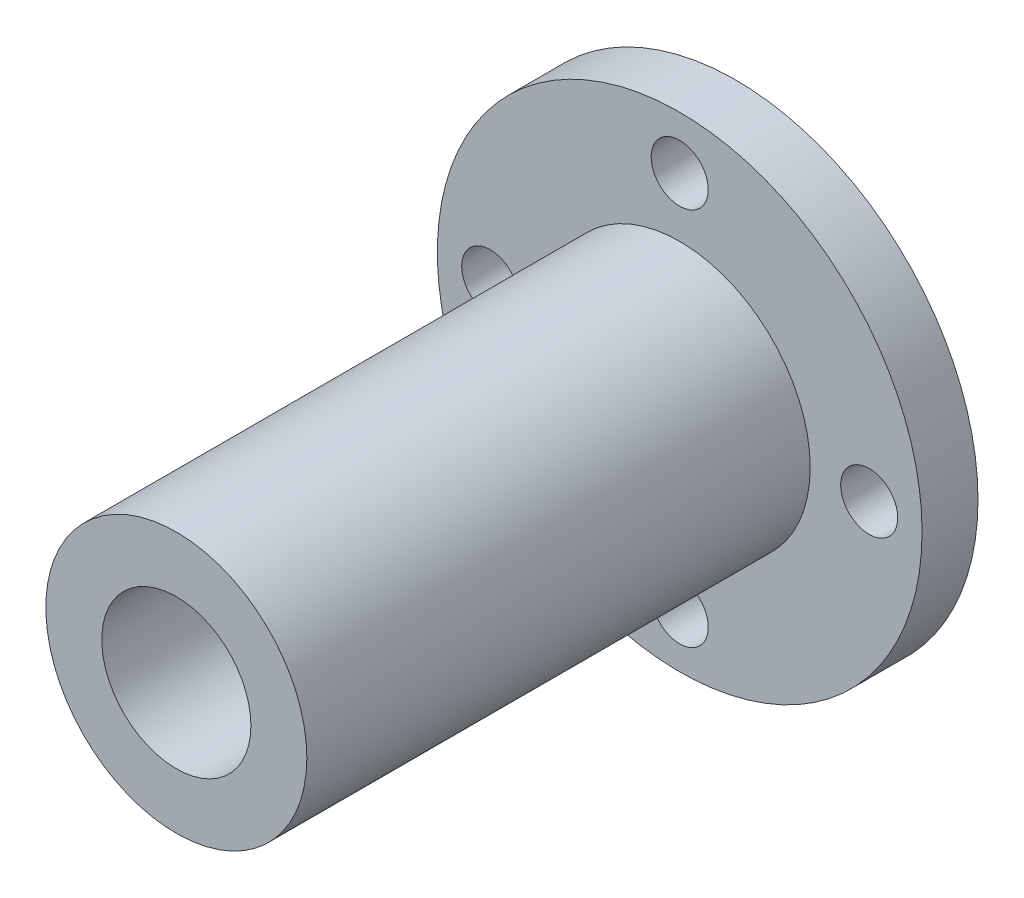
ISO-10303-21;
HEADER;
FILE_DESCRIPTION(('STEP AP214'),'2;1');
FILE_NAME('part.step','',(''),(''),'','','');
FILE_SCHEMA(('AUTOMOTIVE_DESIGN { 1 0 10303 214 1 1 1 1 }'));
ENDSEC;
DATA;
#1=APPLICATION_CONTEXT('core data for automotive mechanical design processes');
#2=APPLICATION_PROTOCOL_DEFINITION('international standard','automotive_design',2000,#1);
#3=PRODUCT_CONTEXT('',#1,'mechanical');
#4=PRODUCT('Part','Part','',(#3));
#5=PRODUCT_RELATED_PRODUCT_CATEGORY('part','',(#4));
#6=PRODUCT_DEFINITION_FORMATION('','',#4);
#7=PRODUCT_DEFINITION_CONTEXT('part definition',#1,'design');
#8=PRODUCT_DEFINITION('design','',#6,#7);
#9=PRODUCT_DEFINITION_SHAPE('','',#8);
#10=(LENGTH_UNIT() NAMED_UNIT(*) SI_UNIT(.MILLI.,.METRE.));
#11=(NAMED_UNIT(*) PLANE_ANGLE_UNIT() SI_UNIT($,.RADIAN.));
#12=(NAMED_UNIT(*) SI_UNIT($,.STERADIAN.) SOLID_ANGLE_UNIT());
#13=UNCERTAINTY_MEASURE_WITH_UNIT(LENGTH_MEASURE(1.E-05),#10,'distance_accuracy_value','');
#14=(GEOMETRIC_REPRESENTATION_CONTEXT(3) GLOBAL_UNCERTAINTY_ASSIGNED_CONTEXT((#13)) GLOBAL_UNIT_ASSIGNED_CONTEXT((#10,
#11,#12)) REPRESENTATION_CONTEXT('',''));
#15=CARTESIAN_POINT('',(0.,0.,0.));
#16=DIRECTION('',(0.,0.,1.));
#17=DIRECTION('',(1.,0.,0.));
#18=AXIS2_PLACEMENT_3D('',#15,#16,#17);
#19=CARTESIAN_POINT('',(0.,-4.,49.0461538461539));
#20=DIRECTION('',(0.,0.,1.));
#21=DIRECTION('',(1.,0.,0.));
#22=AXIS2_PLACEMENT_3D('',#19,#20,#21);
#23=CYLINDRICAL_SURFACE('',#22,4.);
#24=CARTESIAN_POINT('',(0.,-4.,0.));
#25=DIRECTION('',(0.,0.,1.));
#26=DIRECTION('',(1.,0.,0.));
#27=AXIS2_PLACEMENT_3D('',#24,#25,#26);
#28=CIRCLE('',#27,4.);
#29=CARTESIAN_POINT('',(4.,-4.,0.));
#30=VERTEX_POINT('',#29);
#31=EDGE_CURVE('E53',#30,#30,#28,.T.);
#32=ORIENTED_EDGE('',*,*,#31,.F.);
#33=EDGE_LOOP('',(#32));
#34=FACE_BOUND('',#33,.T.);
#35=CARTESIAN_POINT('',(0.,-4.,30.));
#36=DIRECTION('',(0.,0.,1.));
#37=DIRECTION('',(1.,0.,0.));
#38=AXIS2_PLACEMENT_3D('',#35,#36,#37);
#39=CIRCLE('',#38,4.);
#40=CARTESIAN_POINT('',(4.,-4.,30.));
#41=VERTEX_POINT('',#40);
#42=EDGE_CURVE('E10',#41,#41,#39,.T.);
#43=ORIENTED_EDGE('',*,*,#42,.T.);
#44=EDGE_LOOP('',(#43));
#45=FACE_BOUND('',#44,.T.);
#46=ADVANCED_FACE('F31',(#34,#45),#23,.F.);
#47=CARTESIAN_POINT('',(0.,0.,30.));
#48=DIRECTION('',(0.,0.,-1.));
#49=DIRECTION('',(-1.,0.,0.));
#50=AXIS2_PLACEMENT_3D('',#47,#48,#49);
#51=PLANE('',#50);
#52=ORIENTED_EDGE('',*,*,#42,.F.);
#53=EDGE_LOOP('',(#52));
#54=FACE_BOUND('',#53,.T.);
#55=CARTESIAN_POINT('',(0.,-4.,30.));
#56=DIRECTION('',(0.,0.,1.));
#57=DIRECTION('',(1.,0.,0.));
#58=AXIS2_PLACEMENT_3D('',#55,#56,#57);
#59=CIRCLE('',#58,7.);
#60=CARTESIAN_POINT('',(7.,-4.,30.));
#61=VERTEX_POINT('',#60);
#62=EDGE_CURVE('E37',#61,#61,#59,.T.);
#63=ORIENTED_EDGE('',*,*,#62,.T.);
#64=EDGE_LOOP('',(#63));
#65=FACE_BOUND('',#64,.T.);
#66=ADVANCED_FACE('F101',(#54,#65),#51,.F.);
#67=CARTESIAN_POINT('',(0.,-4.,49.0461538461539));
#68=DIRECTION('',(0.,0.,1.));
#69=DIRECTION('',(1.,0.,0.));
#70=AXIS2_PLACEMENT_3D('',#67,#68,#69);
#71=CYLINDRICAL_SURFACE('',#70,7.);
#72=ORIENTED_EDGE('',*,*,#62,.F.);
#73=EDGE_LOOP('',(#72));
#74=FACE_BOUND('',#73,.T.);
#75=CARTESIAN_POINT('',(0.,-4.,3.));
#76=DIRECTION('',(0.,0.,1.));
#77=DIRECTION('',(1.,0.,0.));
#78=AXIS2_PLACEMENT_3D('',#75,#76,#77);
#79=CIRCLE('',#78,7.);
#80=CARTESIAN_POINT('',(7.,-4.,3.));
#81=VERTEX_POINT('',#80);
#82=EDGE_CURVE('E41',#81,#81,#79,.T.);
#83=ORIENTED_EDGE('',*,*,#82,.T.);
#84=EDGE_LOOP('',(#83));
#85=FACE_BOUND('',#84,.T.);
#86=ADVANCED_FACE('F105',(#74,#85),#71,.T.);
#87=CARTESIAN_POINT('',(0.,9.,3.));
#88=DIRECTION('',(0.,0.,-1.));
#89=DIRECTION('',(-1.,0.,0.));
#90=AXIS2_PLACEMENT_3D('',#87,#88,#89);
#91=PLANE('',#90);
#92=CARTESIAN_POINT('',(-10.1638412355352,-4.00000000000004,3.));
#93=DIRECTION('',(0.,0.,-1.));
#94=DIRECTION('',(-1.,0.,0.));
#95=AXIS2_PLACEMENT_3D('',#92,#93,#94);
#96=CIRCLE('',#95,1.53090788465993);
#97=CARTESIAN_POINT('',(-11.6947491201952,-4.00000000000004,3.));
#98=VERTEX_POINT('',#97);
#99=EDGE_CURVE('E62',#98,#98,#96,.T.);
#100=ORIENTED_EDGE('',*,*,#99,.T.);
#101=EDGE_LOOP('',(#100));
#102=FACE_BOUND('',#101,.T.);
#103=CARTESIAN_POINT('',(0.,-14.1638412355352,3.));
#104=DIRECTION('',(0.,0.,-1.));
#105=DIRECTION('',(-1.,0.,0.));
#106=AXIS2_PLACEMENT_3D('',#103,#104,#105);
#107=CIRCLE('',#106,1.53090788465993);
#108=CARTESIAN_POINT('',(-1.53090788465986,-14.1638412355352,3.));
#109=VERTEX_POINT('',#108);
#110=EDGE_CURVE('E65',#109,#109,#107,.T.);
#111=ORIENTED_EDGE('',*,*,#110,.T.);
#112=EDGE_LOOP('',(#111));
#113=FACE_BOUND('',#112,.T.);
#114=CARTESIAN_POINT('',(10.1638412355352,-3.99999999999989,3.));
#115=DIRECTION('',(0.,0.,-1.));
#116=DIRECTION('',(-1.,0.,0.));
#117=AXIS2_PLACEMENT_3D('',#114,#115,#116);
#118=CIRCLE('',#117,1.53090788465993);
#119=CARTESIAN_POINT('',(8.63293335087532,-3.99999999999989,3.));
#120=VERTEX_POINT('',#119);
#121=EDGE_CURVE('E68',#120,#120,#118,.T.);
#122=ORIENTED_EDGE('',*,*,#121,.T.);
#123=EDGE_LOOP('',(#122));
#124=FACE_BOUND('',#123,.T.);
#125=CARTESIAN_POINT('',(0.,6.16384123553525,3.));
#126=DIRECTION('',(0.,0.,-1.));
#127=DIRECTION('',(-1.,0.,0.));
#128=AXIS2_PLACEMENT_3D('',#125,#126,#127);
#129=CIRCLE('',#128,1.53090788465993);
#130=CARTESIAN_POINT('',(-1.53090788465993,6.16384123553525,3.));
#131=VERTEX_POINT('',#130);
#132=EDGE_CURVE('E56',#131,#131,#129,.T.);
#133=ORIENTED_EDGE('',*,*,#132,.T.);
#134=EDGE_LOOP('',(#133));
#135=FACE_BOUND('',#134,.T.);
#136=ORIENTED_EDGE('',*,*,#82,.F.);
#137=EDGE_LOOP('',(#136));
#138=FACE_BOUND('',#137,.T.);
#139=CARTESIAN_POINT('',(0.,-4.,3.));
#140=DIRECTION('',(0.,0.,1.));
#141=DIRECTION('',(1.,0.,0.));
#142=AXIS2_PLACEMENT_3D('',#139,#140,#141);
#143=CIRCLE('',#142,13.);
#144=CARTESIAN_POINT('',(13.,-4.,3.));
#145=VERTEX_POINT('',#144);
#146=EDGE_CURVE('E45',#145,#145,#143,.T.);
#147=ORIENTED_EDGE('',*,*,#146,.T.);
#148=EDGE_LOOP('',(#147));
#149=FACE_BOUND('',#148,.T.);
#150=ADVANCED_FACE('F110',(#102,#113,#124,#135,#138,#149),#91,.F.);
#151=CARTESIAN_POINT('',(0.,-4.,49.0461538461539));
#152=DIRECTION('',(0.,0.,1.));
#153=DIRECTION('',(1.,0.,0.));
#154=AXIS2_PLACEMENT_3D('',#151,#152,#153);
#155=CYLINDRICAL_SURFACE('',#154,13.);
#156=ORIENTED_EDGE('',*,*,#146,.F.);
#157=EDGE_LOOP('',(#156));
#158=FACE_BOUND('',#157,.T.);
#159=CARTESIAN_POINT('',(0.,-4.,0.));
#160=DIRECTION('',(0.,0.,1.));
#161=DIRECTION('',(1.,0.,0.));
#162=AXIS2_PLACEMENT_3D('',#159,#160,#161);
#163=CIRCLE('',#162,13.);
#164=CARTESIAN_POINT('',(13.,-4.,0.));
#165=VERTEX_POINT('',#164);
#166=EDGE_CURVE('E50',#165,#165,#163,.T.);
#167=ORIENTED_EDGE('',*,*,#166,.T.);
#168=EDGE_LOOP('',(#167));
#169=FACE_BOUND('',#168,.T.);
#170=ADVANCED_FACE('F88',(#158,#169),#155,.T.);
#171=CARTESIAN_POINT('',(0.,0.,0.));
#172=DIRECTION('',(0.,0.,1.));
#173=DIRECTION('',(1.,0.,0.));
#174=AXIS2_PLACEMENT_3D('',#171,#172,#173);
#175=PLANE('',#174);
#176=CARTESIAN_POINT('',(-10.1638412355352,-4.00000000000004,0.));
#177=DIRECTION('',(0.,0.,-1.));
#178=DIRECTION('',(-1.,0.,0.));
#179=AXIS2_PLACEMENT_3D('',#176,#177,#178);
#180=CIRCLE('',#179,1.53090788465993);
#181=CARTESIAN_POINT('',(-11.6947491201952,-4.00000000000004,0.));
#182=VERTEX_POINT('',#181);
#183=EDGE_CURVE('E71',#182,#182,#180,.T.);
#184=ORIENTED_EDGE('',*,*,#183,.F.);
#185=EDGE_LOOP('',(#184));
#186=FACE_BOUND('',#185,.T.);
#187=CARTESIAN_POINT('',(0.,-14.1638412355352,0.));
#188=DIRECTION('',(0.,0.,-1.));
#189=DIRECTION('',(-1.,0.,0.));
#190=AXIS2_PLACEMENT_3D('',#187,#188,#189);
#191=CIRCLE('',#190,1.53090788465993);
#192=CARTESIAN_POINT('',(-1.53090788465986,-14.1638412355352,0.));
#193=VERTEX_POINT('',#192);
#194=EDGE_CURVE('E75',#193,#193,#191,.T.);
#195=ORIENTED_EDGE('',*,*,#194,.F.);
#196=EDGE_LOOP('',(#195));
#197=FACE_BOUND('',#196,.T.);
#198=CARTESIAN_POINT('',(10.1638412355352,-3.99999999999989,0.));
#199=DIRECTION('',(0.,0.,-1.));
#200=DIRECTION('',(-1.,0.,0.));
#201=AXIS2_PLACEMENT_3D('',#198,#199,#200);
#202=CIRCLE('',#201,1.53090788465993);
#203=CARTESIAN_POINT('',(8.63293335087532,-3.99999999999989,0.));
#204=VERTEX_POINT('',#203);
#205=EDGE_CURVE('E72',#204,#204,#202,.T.);
#206=ORIENTED_EDGE('',*,*,#205,.F.);
#207=EDGE_LOOP('',(#206));
#208=FACE_BOUND('',#207,.T.);
#209=CARTESIAN_POINT('',(0.,6.16384123553525,0.));
#210=DIRECTION('',(0.,0.,-1.));
#211=DIRECTION('',(-1.,0.,0.));
#212=AXIS2_PLACEMENT_3D('',#209,#210,#211);
#213=CIRCLE('',#212,1.53090788465993);
#214=CARTESIAN_POINT('',(-1.53090788465993,6.16384123553525,0.));
#215=VERTEX_POINT('',#214);
#216=EDGE_CURVE('E59',#215,#215,#213,.T.);
#217=ORIENTED_EDGE('',*,*,#216,.F.);
#218=EDGE_LOOP('',(#217));
#219=FACE_BOUND('',#218,.T.);
#220=ORIENTED_EDGE('',*,*,#166,.F.);
#221=EDGE_LOOP('',(#220));
#222=FACE_BOUND('',#221,.T.);
#223=ORIENTED_EDGE('',*,*,#31,.T.);
#224=EDGE_LOOP('',(#223));
#225=FACE_BOUND('',#224,.T.);
#226=ADVANCED_FACE('F84',(#186,#197,#208,#219,#222,#225),#175,.F.);
#227=CARTESIAN_POINT('',(0.,6.16384123553525,10.));
#228=DIRECTION('',(0.,0.,-1.));
#229=DIRECTION('',(-1.,0.,0.));
#230=AXIS2_PLACEMENT_3D('',#227,#228,#229);
#231=CYLINDRICAL_SURFACE('',#230,1.53090788465993);
#232=ORIENTED_EDGE('',*,*,#216,.T.);
#233=EDGE_LOOP('',(#232));
#234=FACE_BOUND('',#233,.T.);
#235=ORIENTED_EDGE('',*,*,#132,.F.);
#236=EDGE_LOOP('',(#235));
#237=FACE_BOUND('',#236,.T.);
#238=ADVANCED_FACE('F87',(#234,#237),#231,.F.);
#239=CARTESIAN_POINT('',(10.1638412355352,-3.99999999999989,10.));
#240=DIRECTION('',(0.,0.,-1.));
#241=DIRECTION('',(-1.,0.,0.));
#242=AXIS2_PLACEMENT_3D('',#239,#240,#241);
#243=CYLINDRICAL_SURFACE('',#242,1.53090788465993);
#244=ORIENTED_EDGE('',*,*,#205,.T.);
#245=EDGE_LOOP('',(#244));
#246=FACE_BOUND('',#245,.T.);
#247=ORIENTED_EDGE('',*,*,#121,.F.);
#248=EDGE_LOOP('',(#247));
#249=FACE_BOUND('',#248,.T.);
#250=ADVANCED_FACE('F122',(#246,#249),#243,.F.);
#251=CARTESIAN_POINT('',(0.,-14.1638412355352,10.));
#252=DIRECTION('',(0.,0.,-1.));
#253=DIRECTION('',(-1.,0.,0.));
#254=AXIS2_PLACEMENT_3D('',#251,#252,#253);
#255=CYLINDRICAL_SURFACE('',#254,1.53090788465993);
#256=ORIENTED_EDGE('',*,*,#194,.T.);
#257=EDGE_LOOP('',(#256));
#258=FACE_BOUND('',#257,.T.);
#259=ORIENTED_EDGE('',*,*,#110,.F.);
#260=EDGE_LOOP('',(#259));
#261=FACE_BOUND('',#260,.T.);
#262=ADVANCED_FACE('F126',(#258,#261),#255,.F.);
#263=CARTESIAN_POINT('',(-10.1638412355352,-4.00000000000004,10.));
#264=DIRECTION('',(0.,0.,-1.));
#265=DIRECTION('',(-1.,0.,0.));
#266=AXIS2_PLACEMENT_3D('',#263,#264,#265);
#267=CYLINDRICAL_SURFACE('',#266,1.53090788465993);
#268=ORIENTED_EDGE('',*,*,#183,.T.);
#269=EDGE_LOOP('',(#268));
#270=FACE_BOUND('',#269,.T.);
#271=ORIENTED_EDGE('',*,*,#99,.F.);
#272=EDGE_LOOP('',(#271));
#273=FACE_BOUND('',#272,.T.);
#274=ADVANCED_FACE('F81',(#270,#273),#267,.F.);
#275=CLOSED_SHELL('',(#46,#66,#86,#150,#170,#226,#238,#250,#262,#274));
#276=MANIFOLD_SOLID_BREP('B2',#275);
#277=ADVANCED_BREP_SHAPE_REPRESENTATION('',(#18,#276),#14);
#278=SHAPE_DEFINITION_REPRESENTATION(#9,#277);
ENDSEC;
END-ISO-10303-21;
